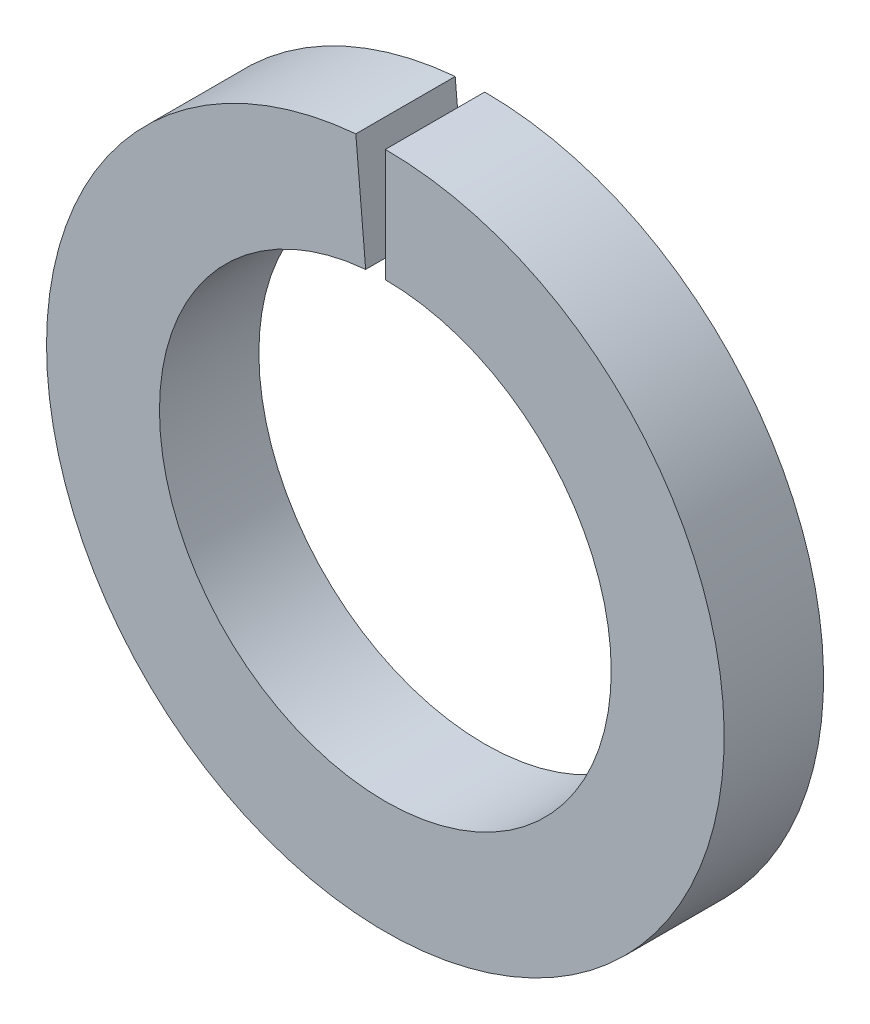
ISO-10303-21;
HEADER;
FILE_DESCRIPTION(('STEP AP214'),'2;1');
FILE_NAME('part.step','',(''),(''),'','','');
FILE_SCHEMA(('AUTOMOTIVE_DESIGN { 1 0 10303 214 1 1 1 1 }'));
ENDSEC;
DATA;
#1=APPLICATION_CONTEXT('core data for automotive mechanical design processes');
#2=APPLICATION_PROTOCOL_DEFINITION('international standard','automotive_design',2000,#1);
#3=PRODUCT_CONTEXT('',#1,'mechanical');
#4=PRODUCT('Part','Part','',(#3));
#5=PRODUCT_RELATED_PRODUCT_CATEGORY('part','',(#4));
#6=PRODUCT_DEFINITION_FORMATION('','',#4);
#7=PRODUCT_DEFINITION_CONTEXT('part definition',#1,'design');
#8=PRODUCT_DEFINITION('design','',#6,#7);
#9=PRODUCT_DEFINITION_SHAPE('','',#8);
#10=(LENGTH_UNIT() NAMED_UNIT(*) SI_UNIT(.MILLI.,.METRE.));
#11=(NAMED_UNIT(*) PLANE_ANGLE_UNIT() SI_UNIT($,.RADIAN.));
#12=(NAMED_UNIT(*) SI_UNIT($,.STERADIAN.) SOLID_ANGLE_UNIT());
#13=UNCERTAINTY_MEASURE_WITH_UNIT(LENGTH_MEASURE(1.E-05),#10,'distance_accuracy_value','');
#14=(GEOMETRIC_REPRESENTATION_CONTEXT(3) GLOBAL_UNCERTAINTY_ASSIGNED_CONTEXT((#13)) GLOBAL_UNIT_ASSIGNED_CONTEXT((#10,
#11,#12)) REPRESENTATION_CONTEXT('',''));
#15=CARTESIAN_POINT('',(0.,0.,0.));
#16=DIRECTION('',(0.,0.,1.));
#17=DIRECTION('',(1.,0.,0.));
#18=AXIS2_PLACEMENT_3D('',#15,#16,#17);
#19=CARTESIAN_POINT('',(0.,0.,2.2));
#20=DIRECTION('',(0.,0.,-1.));
#21=DIRECTION('',(-1.,0.,0.));
#22=AXIS2_PLACEMENT_3D('',#19,#20,#21);
#23=CYLINDRICAL_SURFACE('',#22,7.5);
#24=CARTESIAN_POINT('',(0.,0.,0.));
#25=DIRECTION('',(0.,0.,1.));
#26=DIRECTION('',(1.,0.,0.));
#27=AXIS2_PLACEMENT_3D('',#24,#25,#26);
#28=CIRCLE('',#27,7.5);
#29=CARTESIAN_POINT('',(-0.653668070607437,7.47146023568809,0.));
#30=VERTEX_POINT('',#29);
#31=CARTESIAN_POINT('',(0.,7.5,0.));
#32=VERTEX_POINT('',#31);
#33=EDGE_CURVE('E96',#30,#32,#28,.T.);
#34=ORIENTED_EDGE('',*,*,#33,.T.);
#35=DIRECTION('',(0.,0.,-1.));
#36=VECTOR('',#35,1.);
#37=CARTESIAN_POINT('',(0.,7.5,2.2));
#38=LINE('',#37,#36);
#39=CARTESIAN_POINT('',(0.,7.5,2.2));
#40=VERTEX_POINT('',#39);
#41=EDGE_CURVE('E11',#40,#32,#38,.T.);
#42=ORIENTED_EDGE('',*,*,#41,.F.);
#43=CARTESIAN_POINT('',(0.,0.,2.2));
#44=DIRECTION('',(0.,0.,1.));
#45=DIRECTION('',(1.,0.,0.));
#46=AXIS2_PLACEMENT_3D('',#43,#44,#45);
#47=CIRCLE('',#46,7.5);
#48=CARTESIAN_POINT('',(-0.653668070607437,7.47146023568809,2.2));
#49=VERTEX_POINT('',#48);
#50=EDGE_CURVE('E84',#49,#40,#47,.T.);
#51=ORIENTED_EDGE('',*,*,#50,.F.);
#52=DIRECTION('',(0.,0.,-1.));
#53=VECTOR('',#52,1.);
#54=CARTESIAN_POINT('',(-0.653668070607437,7.47146023568809,2.2));
#55=LINE('',#54,#53);
#56=EDGE_CURVE('E92',#49,#30,#55,.T.);
#57=ORIENTED_EDGE('',*,*,#56,.T.);
#58=EDGE_LOOP('',(#34,#42,#51,#57));
#59=FACE_BOUND('',#58,.T.);
#60=ADVANCED_FACE('F33',(#59),#23,.T.);
#61=CARTESIAN_POINT('',(0.,5.,2.2));
#62=DIRECTION('',(1.,0.,0.));
#63=DIRECTION('',(0.,0.,-1.));
#64=AXIS2_PLACEMENT_3D('',#61,#62,#63);
#65=PLANE('',#64);
#66=DIRECTION('',(0.,-1.,0.));
#67=VECTOR('',#66,1.);
#68=CARTESIAN_POINT('',(0.,5.,0.));
#69=LINE('',#68,#67);
#70=CARTESIAN_POINT('',(0.,5.,0.));
#71=VERTEX_POINT('',#70);
#72=EDGE_CURVE('E88',#32,#71,#69,.T.);
#73=ORIENTED_EDGE('',*,*,#72,.T.);
#74=DIRECTION('',(0.,0.,-1.));
#75=VECTOR('',#74,1.);
#76=CARTESIAN_POINT('',(0.,5.,2.2));
#77=LINE('',#76,#75);
#78=CARTESIAN_POINT('',(0.,5.,2.2));
#79=VERTEX_POINT('',#78);
#80=EDGE_CURVE('E41',#79,#71,#77,.T.);
#81=ORIENTED_EDGE('',*,*,#80,.F.);
#82=DIRECTION('',(0.,-1.,0.));
#83=VECTOR('',#82,1.);
#84=CARTESIAN_POINT('',(0.,5.,2.2));
#85=LINE('',#84,#83);
#86=EDGE_CURVE('E79',#40,#79,#85,.T.);
#87=ORIENTED_EDGE('',*,*,#86,.F.);
#88=ORIENTED_EDGE('',*,*,#41,.T.);
#89=EDGE_LOOP('',(#73,#81,#87,#88));
#90=FACE_BOUND('',#89,.T.);
#91=ADVANCED_FACE('F87',(#90),#65,.F.);
#92=CARTESIAN_POINT('',(0.,0.,2.2));
#93=DIRECTION('',(0.,0.,-1.));
#94=DIRECTION('',(-1.,0.,0.));
#95=AXIS2_PLACEMENT_3D('',#92,#93,#94);
#96=CYLINDRICAL_SURFACE('',#95,5.);
#97=CARTESIAN_POINT('',(0.,0.,0.));
#98=DIRECTION('',(0.,0.,-1.));
#99=DIRECTION('',(-1.,0.,0.));
#100=AXIS2_PLACEMENT_3D('',#97,#98,#99);
#101=CIRCLE('',#100,5.);
#102=CARTESIAN_POINT('',(-0.435778713738291,4.98097349045873,0.));
#103=VERTEX_POINT('',#102);
#104=EDGE_CURVE('E66',#71,#103,#101,.T.);
#105=ORIENTED_EDGE('',*,*,#104,.T.);
#106=DIRECTION('',(0.,0.,-1.));
#107=VECTOR('',#106,1.);
#108=CARTESIAN_POINT('',(-0.435778713738291,4.98097349045873,2.2));
#109=LINE('',#108,#107);
#110=CARTESIAN_POINT('',(-0.435778713738291,4.98097349045873,2.2));
#111=VERTEX_POINT('',#110);
#112=EDGE_CURVE('E89',#111,#103,#109,.T.);
#113=ORIENTED_EDGE('',*,*,#112,.F.);
#114=CARTESIAN_POINT('',(0.,0.,2.2));
#115=DIRECTION('',(0.,0.,-1.));
#116=DIRECTION('',(-1.,0.,0.));
#117=AXIS2_PLACEMENT_3D('',#114,#115,#116);
#118=CIRCLE('',#117,5.);
#119=EDGE_CURVE('E82',#79,#111,#118,.T.);
#120=ORIENTED_EDGE('',*,*,#119,.F.);
#121=ORIENTED_EDGE('',*,*,#80,.T.);
#122=EDGE_LOOP('',(#105,#113,#120,#121));
#123=FACE_BOUND('',#122,.T.);
#124=ADVANCED_FACE('F90',(#123),#96,.F.);
#125=CARTESIAN_POINT('',(-0.653668070607437,7.47146023568809,2.2));
#126=DIRECTION('',(-0.996194698091746,-0.0871557427476583,0.));
#127=DIRECTION('',(0.0871557427476583,-0.996194698091746,0.));
#128=AXIS2_PLACEMENT_3D('',#125,#126,#127);
#129=PLANE('',#128);
#130=DIRECTION('',(-0.0871557427476583,0.996194698091745,0.));
#131=VECTOR('',#130,1.);
#132=CARTESIAN_POINT('',(-0.653668070607437,7.47146023568809,0.));
#133=LINE('',#132,#131);
#134=EDGE_CURVE('E72',#103,#30,#133,.T.);
#135=ORIENTED_EDGE('',*,*,#134,.T.);
#136=ORIENTED_EDGE('',*,*,#56,.F.);
#137=DIRECTION('',(-0.0871557427476583,0.996194698091745,0.));
#138=VECTOR('',#137,1.);
#139=CARTESIAN_POINT('',(-0.653668070607437,7.47146023568809,2.2));
#140=LINE('',#139,#138);
#141=EDGE_CURVE('E49',#111,#49,#140,.T.);
#142=ORIENTED_EDGE('',*,*,#141,.F.);
#143=ORIENTED_EDGE('',*,*,#112,.T.);
#144=EDGE_LOOP('',(#135,#136,#142,#143));
#145=FACE_BOUND('',#144,.T.);
#146=ADVANCED_FACE('F103',(#145),#129,.F.);
#147=CARTESIAN_POINT('',(0.,0.,2.2));
#148=DIRECTION('',(0.,0.,1.));
#149=DIRECTION('',(1.,0.,0.));
#150=AXIS2_PLACEMENT_3D('',#147,#148,#149);
#151=PLANE('',#150);
#152=ORIENTED_EDGE('',*,*,#50,.T.);
#153=ORIENTED_EDGE('',*,*,#86,.T.);
#154=ORIENTED_EDGE('',*,*,#119,.T.);
#155=ORIENTED_EDGE('',*,*,#141,.T.);
#156=EDGE_LOOP('',(#152,#153,#154,#155));
#157=FACE_BOUND('',#156,.T.);
#158=ADVANCED_FACE('F80',(#157),#151,.T.);
#159=CARTESIAN_POINT('',(0.,0.,0.));
#160=DIRECTION('',(0.,0.,1.));
#161=DIRECTION('',(1.,0.,0.));
#162=AXIS2_PLACEMENT_3D('',#159,#160,#161);
#163=PLANE('',#162);
#164=ORIENTED_EDGE('',*,*,#33,.F.);
#165=ORIENTED_EDGE('',*,*,#134,.F.);
#166=ORIENTED_EDGE('',*,*,#104,.F.);
#167=ORIENTED_EDGE('',*,*,#72,.F.);
#168=EDGE_LOOP('',(#164,#165,#166,#167));
#169=FACE_BOUND('',#168,.T.);
#170=ADVANCED_FACE('F106',(#169),#163,.F.);
#171=CLOSED_SHELL('',(#60,#91,#124,#146,#158,#170));
#172=MANIFOLD_SOLID_BREP('B2',#171);
#173=ADVANCED_BREP_SHAPE_REPRESENTATION('',(#18,#172),#14);
#174=SHAPE_DEFINITION_REPRESENTATION(#9,#173);
ENDSEC;
END-ISO-10303-21;
